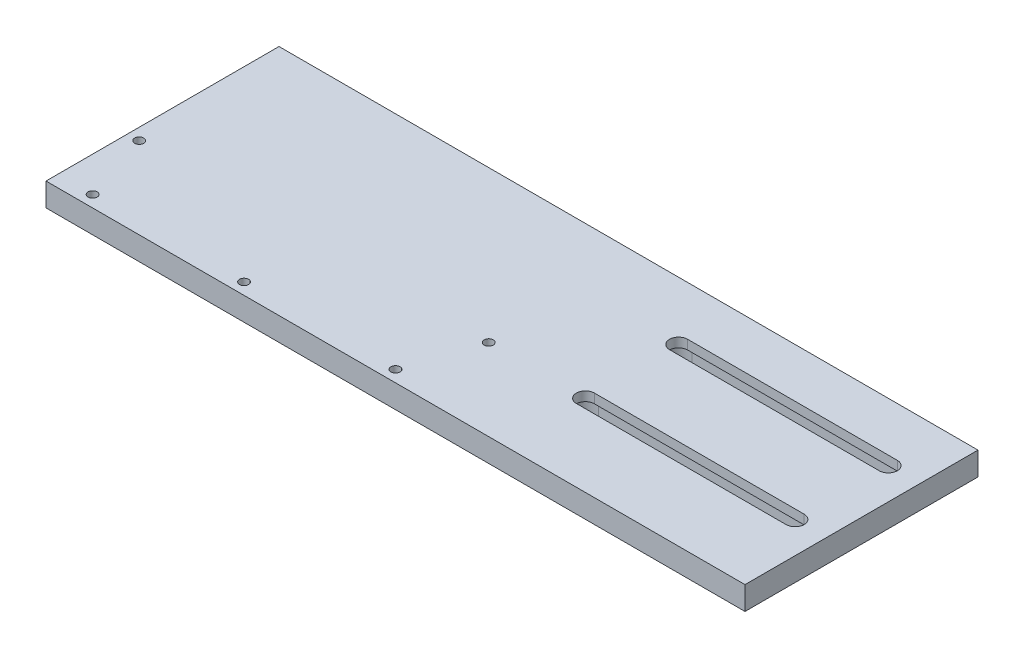
ISO-10303-21;
HEADER;
FILE_DESCRIPTION(('STEP AP214'),'2;1');
FILE_NAME('part.step','',(''),(''),'','','');
FILE_SCHEMA(('AUTOMOTIVE_DESIGN { 1 0 10303 214 1 1 1 1 }'));
ENDSEC;
DATA;
#1=APPLICATION_CONTEXT('core data for automotive mechanical design processes');
#2=APPLICATION_PROTOCOL_DEFINITION('international standard','automotive_design',2000,#1);
#3=PRODUCT_CONTEXT('',#1,'mechanical');
#4=PRODUCT('Part','Part','',(#3));
#5=PRODUCT_RELATED_PRODUCT_CATEGORY('part','',(#4));
#6=PRODUCT_DEFINITION_FORMATION('','',#4);
#7=PRODUCT_DEFINITION_CONTEXT('part definition',#1,'design');
#8=PRODUCT_DEFINITION('design','',#6,#7);
#9=PRODUCT_DEFINITION_SHAPE('','',#8);
#10=(LENGTH_UNIT() NAMED_UNIT(*) SI_UNIT(.MILLI.,.METRE.));
#11=(NAMED_UNIT(*) PLANE_ANGLE_UNIT() SI_UNIT($,.RADIAN.));
#12=(NAMED_UNIT(*) SI_UNIT($,.STERADIAN.) SOLID_ANGLE_UNIT());
#13=UNCERTAINTY_MEASURE_WITH_UNIT(LENGTH_MEASURE(1.E-05),#10,'distance_accuracy_value','');
#14=(GEOMETRIC_REPRESENTATION_CONTEXT(3) GLOBAL_UNCERTAINTY_ASSIGNED_CONTEXT((#13)) GLOBAL_UNIT_ASSIGNED_CONTEXT((#10,
#11,#12)) REPRESENTATION_CONTEXT('',''));
#15=CARTESIAN_POINT('',(0.,0.,0.));
#16=DIRECTION('',(0.,0.,1.));
#17=DIRECTION('',(1.,0.,0.));
#18=AXIS2_PLACEMENT_3D('',#15,#16,#17);
#19=CARTESIAN_POINT('',(59.055,12.7,-31.75));
#20=DIRECTION('',(0.,-1.,0.));
#21=DIRECTION('',(0.,0.,-1.));
#22=AXIS2_PLACEMENT_3D('',#19,#20,#21);
#23=CYLINDRICAL_SURFACE('',#22,4.9276);
#24=CARTESIAN_POINT('',(59.055,7.62,-31.75));
#25=DIRECTION('',(0.,-1.,0.));
#26=DIRECTION('',(0.,0.,-1.));
#27=AXIS2_PLACEMENT_3D('',#24,#25,#26);
#28=CIRCLE('',#27,4.9276);
#29=CARTESIAN_POINT('',(59.055,7.62,-36.6776));
#30=VERTEX_POINT('',#29);
#31=CARTESIAN_POINT('',(59.055,7.62,-26.8224));
#32=VERTEX_POINT('',#31);
#33=EDGE_CURVE('E210',#30,#32,#28,.F.);
#34=ORIENTED_EDGE('',*,*,#33,.F.);
#35=DIRECTION('',(0.,-1.,0.));
#36=VECTOR('',#35,1.);
#37=CARTESIAN_POINT('',(59.055,12.7,-36.6776));
#38=LINE('',#37,#36);
#39=CARTESIAN_POINT('',(59.055,12.7,-36.6776));
#40=VERTEX_POINT('',#39);
#41=EDGE_CURVE('E307',#40,#30,#38,.T.);
#42=ORIENTED_EDGE('',*,*,#41,.F.);
#43=CARTESIAN_POINT('',(59.055,12.7,-31.75));
#44=DIRECTION('',(0.,-1.,0.));
#45=DIRECTION('',(0.,0.,-1.));
#46=AXIS2_PLACEMENT_3D('',#43,#44,#45);
#47=CIRCLE('',#46,4.9276);
#48=CARTESIAN_POINT('',(59.055,12.7,-26.8224));
#49=VERTEX_POINT('',#48);
#50=EDGE_CURVE('E295',#49,#40,#47,.T.);
#51=ORIENTED_EDGE('',*,*,#50,.F.);
#52=DIRECTION('',(0.,-1.,0.));
#53=VECTOR('',#52,1.);
#54=CARTESIAN_POINT('',(59.055,12.7,-26.8224));
#55=LINE('',#54,#53);
#56=EDGE_CURVE('E308',#49,#32,#55,.T.);
#57=ORIENTED_EDGE('',*,*,#56,.T.);
#58=EDGE_LOOP('',(#34,#42,#51,#57));
#59=FACE_BOUND('',#58,.T.);
#60=ADVANCED_FACE('F33',(#59),#23,.F.);
#61=CARTESIAN_POINT('',(59.055,12.7,-26.8224));
#62=DIRECTION('',(0.,0.,1.));
#63=DIRECTION('',(1.,0.,0.));
#64=AXIS2_PLACEMENT_3D('',#61,#62,#63);
#65=PLANE('',#64);
#66=DIRECTION('',(1.,0.,0.));
#67=VECTOR('',#66,1.);
#68=CARTESIAN_POINT('',(59.055,7.62,-26.8224));
#69=LINE('',#68,#67);
#70=CARTESIAN_POINT('',(173.355,7.62,-26.8224));
#71=VERTEX_POINT('',#70);
#72=EDGE_CURVE('E208',#32,#71,#69,.T.);
#73=ORIENTED_EDGE('',*,*,#72,.F.);
#74=ORIENTED_EDGE('',*,*,#56,.F.);
#75=DIRECTION('',(-1.,0.,0.));
#76=VECTOR('',#75,1.);
#77=CARTESIAN_POINT('',(59.055,12.7,-26.8224));
#78=LINE('',#77,#76);
#79=CARTESIAN_POINT('',(173.355,12.7,-26.8224));
#80=VERTEX_POINT('',#79);
#81=EDGE_CURVE('E304',#80,#49,#78,.T.);
#82=ORIENTED_EDGE('',*,*,#81,.F.);
#83=DIRECTION('',(0.,-1.,0.));
#84=VECTOR('',#83,1.);
#85=CARTESIAN_POINT('',(173.355,12.7,-26.8224));
#86=LINE('',#85,#84);
#87=EDGE_CURVE('E312',#80,#71,#86,.T.);
#88=ORIENTED_EDGE('',*,*,#87,.T.);
#89=EDGE_LOOP('',(#73,#74,#82,#88));
#90=FACE_BOUND('',#89,.T.);
#91=ADVANCED_FACE('F402',(#90),#65,.F.);
#92=CARTESIAN_POINT('',(173.355,12.7,-31.75));
#93=DIRECTION('',(0.,-1.,0.));
#94=DIRECTION('',(0.,0.,-1.));
#95=AXIS2_PLACEMENT_3D('',#92,#93,#94);
#96=CYLINDRICAL_SURFACE('',#95,4.92759999999999);
#97=CARTESIAN_POINT('',(173.355,7.62,-31.75));
#98=DIRECTION('',(0.,-1.,0.));
#99=DIRECTION('',(0.,0.,-1.));
#100=AXIS2_PLACEMENT_3D('',#97,#98,#99);
#101=CIRCLE('',#100,4.92759999999999);
#102=CARTESIAN_POINT('',(173.355,7.62,-36.6776));
#103=VERTEX_POINT('',#102);
#104=EDGE_CURVE('E55',#71,#103,#101,.F.);
#105=ORIENTED_EDGE('',*,*,#104,.F.);
#106=ORIENTED_EDGE('',*,*,#87,.F.);
#107=CARTESIAN_POINT('',(173.355,12.7,-31.75));
#108=DIRECTION('',(0.,-1.,0.));
#109=DIRECTION('',(0.,0.,-1.));
#110=AXIS2_PLACEMENT_3D('',#107,#108,#109);
#111=CIRCLE('',#110,4.92759999999999);
#112=CARTESIAN_POINT('',(173.355,12.7,-36.6776));
#113=VERTEX_POINT('',#112);
#114=EDGE_CURVE('E301',#113,#80,#111,.T.);
#115=ORIENTED_EDGE('',*,*,#114,.F.);
#116=DIRECTION('',(0.,-1.,0.));
#117=VECTOR('',#116,1.);
#118=CARTESIAN_POINT('',(173.355,12.7,-36.6776));
#119=LINE('',#118,#117);
#120=EDGE_CURVE('E315',#113,#103,#119,.T.);
#121=ORIENTED_EDGE('',*,*,#120,.T.);
#122=EDGE_LOOP('',(#105,#106,#115,#121));
#123=FACE_BOUND('',#122,.T.);
#124=ADVANCED_FACE('F408',(#123),#96,.F.);
#125=CARTESIAN_POINT('',(173.355,12.7,-36.6776));
#126=DIRECTION('',(0.,0.,-1.));
#127=DIRECTION('',(-1.,0.,0.));
#128=AXIS2_PLACEMENT_3D('',#125,#126,#127);
#129=PLANE('',#128);
#130=DIRECTION('',(-1.,0.,0.));
#131=VECTOR('',#130,1.);
#132=CARTESIAN_POINT('',(173.355,7.62,-36.6776));
#133=LINE('',#132,#131);
#134=EDGE_CURVE('E11',#103,#30,#133,.T.);
#135=ORIENTED_EDGE('',*,*,#134,.F.);
#136=ORIENTED_EDGE('',*,*,#120,.F.);
#137=DIRECTION('',(1.,0.,0.));
#138=VECTOR('',#137,1.);
#139=CARTESIAN_POINT('',(173.355,12.7,-36.6776));
#140=LINE('',#139,#138);
#141=EDGE_CURVE('E298',#40,#113,#140,.T.);
#142=ORIENTED_EDGE('',*,*,#141,.F.);
#143=ORIENTED_EDGE('',*,*,#41,.T.);
#144=EDGE_LOOP('',(#135,#136,#142,#143));
#145=FACE_BOUND('',#144,.T.);
#146=ADVANCED_FACE('F413',(#145),#129,.F.);
#147=CARTESIAN_POINT('',(59.055,12.7,19.05));
#148=DIRECTION('',(0.,-1.,0.));
#149=DIRECTION('',(0.,0.,-1.));
#150=AXIS2_PLACEMENT_3D('',#147,#148,#149);
#151=CYLINDRICAL_SURFACE('',#150,4.9276);
#152=CARTESIAN_POINT('',(59.055,7.62,19.05));
#153=DIRECTION('',(0.,-1.,0.));
#154=DIRECTION('',(0.,0.,-1.));
#155=AXIS2_PLACEMENT_3D('',#152,#153,#154);
#156=CIRCLE('',#155,4.9276);
#157=CARTESIAN_POINT('',(59.055,7.62,14.1224));
#158=VERTEX_POINT('',#157);
#159=CARTESIAN_POINT('',(59.055,7.62,23.9776));
#160=VERTEX_POINT('',#159);
#161=EDGE_CURVE('E248',#158,#160,#156,.F.);
#162=ORIENTED_EDGE('',*,*,#161,.F.);
#163=DIRECTION('',(0.,-1.,0.));
#164=VECTOR('',#163,1.);
#165=CARTESIAN_POINT('',(59.055,12.7,14.1224));
#166=LINE('',#165,#164);
#167=CARTESIAN_POINT('',(59.055,12.7,14.1224));
#168=VERTEX_POINT('',#167);
#169=EDGE_CURVE('E331',#168,#158,#166,.T.);
#170=ORIENTED_EDGE('',*,*,#169,.F.);
#171=CARTESIAN_POINT('',(59.055,12.7,19.05));
#172=DIRECTION('',(0.,-1.,0.));
#173=DIRECTION('',(0.,0.,-1.));
#174=AXIS2_PLACEMENT_3D('',#171,#172,#173);
#175=CIRCLE('',#174,4.9276);
#176=CARTESIAN_POINT('',(59.055,12.7,23.9776));
#177=VERTEX_POINT('',#176);
#178=EDGE_CURVE('E311',#177,#168,#175,.T.);
#179=ORIENTED_EDGE('',*,*,#178,.F.);
#180=DIRECTION('',(0.,-1.,0.));
#181=VECTOR('',#180,1.);
#182=CARTESIAN_POINT('',(59.055,12.7,23.9776));
#183=LINE('',#182,#181);
#184=EDGE_CURVE('E332',#177,#160,#183,.T.);
#185=ORIENTED_EDGE('',*,*,#184,.T.);
#186=EDGE_LOOP('',(#162,#170,#179,#185));
#187=FACE_BOUND('',#186,.T.);
#188=ADVANCED_FACE('F381',(#187),#151,.F.);
#189=CARTESIAN_POINT('',(59.055,12.7,23.9776));
#190=DIRECTION('',(0.,0.,1.));
#191=DIRECTION('',(1.,0.,0.));
#192=AXIS2_PLACEMENT_3D('',#189,#190,#191);
#193=PLANE('',#192);
#194=DIRECTION('',(1.,0.,0.));
#195=VECTOR('',#194,1.);
#196=CARTESIAN_POINT('',(59.055,7.62,23.9776));
#197=LINE('',#196,#195);
#198=CARTESIAN_POINT('',(173.355,7.62,23.9776));
#199=VERTEX_POINT('',#198);
#200=EDGE_CURVE('E246',#160,#199,#197,.T.);
#201=ORIENTED_EDGE('',*,*,#200,.F.);
#202=ORIENTED_EDGE('',*,*,#184,.F.);
#203=DIRECTION('',(-1.,0.,0.));
#204=VECTOR('',#203,1.);
#205=CARTESIAN_POINT('',(59.055,12.7,23.9776));
#206=LINE('',#205,#204);
#207=CARTESIAN_POINT('',(173.355,12.7,23.9776));
#208=VERTEX_POINT('',#207);
#209=EDGE_CURVE('E328',#208,#177,#206,.T.);
#210=ORIENTED_EDGE('',*,*,#209,.F.);
#211=DIRECTION('',(0.,-1.,0.));
#212=VECTOR('',#211,1.);
#213=CARTESIAN_POINT('',(173.355,12.7,23.9776));
#214=LINE('',#213,#212);
#215=EDGE_CURVE('E336',#208,#199,#214,.T.);
#216=ORIENTED_EDGE('',*,*,#215,.T.);
#217=EDGE_LOOP('',(#201,#202,#210,#216));
#218=FACE_BOUND('',#217,.T.);
#219=ADVANCED_FACE('F390',(#218),#193,.F.);
#220=CARTESIAN_POINT('',(173.355,12.7,19.05));
#221=DIRECTION('',(0.,-1.,0.));
#222=DIRECTION('',(0.,0.,-1.));
#223=AXIS2_PLACEMENT_3D('',#220,#221,#222);
#224=CYLINDRICAL_SURFACE('',#223,4.9276);
#225=CARTESIAN_POINT('',(173.355,7.62,19.05));
#226=DIRECTION('',(0.,-1.,0.));
#227=DIRECTION('',(0.,0.,-1.));
#228=AXIS2_PLACEMENT_3D('',#225,#226,#227);
#229=CIRCLE('',#228,4.9276);
#230=CARTESIAN_POINT('',(173.355,7.62,14.1224));
#231=VERTEX_POINT('',#230);
#232=EDGE_CURVE('E238',#199,#231,#229,.F.);
#233=ORIENTED_EDGE('',*,*,#232,.F.);
#234=ORIENTED_EDGE('',*,*,#215,.F.);
#235=CARTESIAN_POINT('',(173.355,12.7,19.05));
#236=DIRECTION('',(0.,-1.,0.));
#237=DIRECTION('',(0.,0.,-1.));
#238=AXIS2_PLACEMENT_3D('',#235,#236,#237);
#239=CIRCLE('',#238,4.9276);
#240=CARTESIAN_POINT('',(173.355,12.7,14.1224));
#241=VERTEX_POINT('',#240);
#242=EDGE_CURVE('E325',#241,#208,#239,.T.);
#243=ORIENTED_EDGE('',*,*,#242,.F.);
#244=DIRECTION('',(0.,-1.,0.));
#245=VECTOR('',#244,1.);
#246=CARTESIAN_POINT('',(173.355,12.7,14.1224));
#247=LINE('',#246,#245);
#248=EDGE_CURVE('E339',#241,#231,#247,.T.);
#249=ORIENTED_EDGE('',*,*,#248,.T.);
#250=EDGE_LOOP('',(#233,#234,#243,#249));
#251=FACE_BOUND('',#250,.T.);
#252=ADVANCED_FACE('F392',(#251),#224,.F.);
#253=CARTESIAN_POINT('',(59.055,12.7,14.1224));
#254=DIRECTION('',(0.,0.,-1.));
#255=DIRECTION('',(-1.,0.,0.));
#256=AXIS2_PLACEMENT_3D('',#253,#254,#255);
#257=PLANE('',#256);
#258=DIRECTION('',(-1.,0.,0.));
#259=VECTOR('',#258,1.);
#260=CARTESIAN_POINT('',(59.055,7.62,14.1224));
#261=LINE('',#260,#259);
#262=EDGE_CURVE('E41',#231,#158,#261,.T.);
#263=ORIENTED_EDGE('',*,*,#262,.F.);
#264=ORIENTED_EDGE('',*,*,#248,.F.);
#265=DIRECTION('',(1.,0.,0.));
#266=VECTOR('',#265,1.);
#267=CARTESIAN_POINT('',(59.055,12.7,14.1224));
#268=LINE('',#267,#266);
#269=EDGE_CURVE('E322',#168,#241,#268,.T.);
#270=ORIENTED_EDGE('',*,*,#269,.F.);
#271=ORIENTED_EDGE('',*,*,#169,.T.);
#272=EDGE_LOOP('',(#263,#264,#270,#271));
#273=FACE_BOUND('',#272,.T.);
#274=ADVANCED_FACE('F384',(#273),#257,.F.);
#275=CARTESIAN_POINT('',(190.5,12.7,63.5));
#276=DIRECTION('',(-1.,0.,0.));
#277=DIRECTION('',(0.,0.,1.));
#278=AXIS2_PLACEMENT_3D('',#275,#276,#277);
#279=PLANE('',#278);
#280=DIRECTION('',(0.,0.,-1.));
#281=VECTOR('',#280,1.);
#282=CARTESIAN_POINT('',(190.5,0.,63.5));
#283=LINE('',#282,#281);
#284=CARTESIAN_POINT('',(190.5,0.,63.5));
#285=VERTEX_POINT('',#284);
#286=CARTESIAN_POINT('',(190.5,0.,-63.5));
#287=VERTEX_POINT('',#286);
#288=EDGE_CURVE('E335',#285,#287,#283,.T.);
#289=ORIENTED_EDGE('',*,*,#288,.T.);
#290=DIRECTION('',(0.,-1.,0.));
#291=VECTOR('',#290,1.);
#292=CARTESIAN_POINT('',(190.5,12.7,-63.5));
#293=LINE('',#292,#291);
#294=CARTESIAN_POINT('',(190.5,12.7,-63.5));
#295=VERTEX_POINT('',#294);
#296=EDGE_CURVE('E370',#295,#287,#293,.T.);
#297=ORIENTED_EDGE('',*,*,#296,.F.);
#298=DIRECTION('',(0.,0.,-1.));
#299=VECTOR('',#298,1.);
#300=CARTESIAN_POINT('',(190.5,12.7,63.5));
#301=LINE('',#300,#299);
#302=CARTESIAN_POINT('',(190.5,12.7,63.5));
#303=VERTEX_POINT('',#302);
#304=EDGE_CURVE('E344',#303,#295,#301,.T.);
#305=ORIENTED_EDGE('',*,*,#304,.F.);
#306=DIRECTION('',(0.,-1.,0.));
#307=VECTOR('',#306,1.);
#308=CARTESIAN_POINT('',(190.5,12.7,63.5));
#309=LINE('',#308,#307);
#310=EDGE_CURVE('E354',#303,#285,#309,.T.);
#311=ORIENTED_EDGE('',*,*,#310,.T.);
#312=EDGE_LOOP('',(#289,#297,#305,#311));
#313=FACE_BOUND('',#312,.T.);
#314=ADVANCED_FACE('F35',(#313),#279,.F.);
#315=CARTESIAN_POINT('',(-190.5,12.7,-63.5));
#316=DIRECTION('',(0.,0.,1.));
#317=DIRECTION('',(1.,0.,0.));
#318=AXIS2_PLACEMENT_3D('',#315,#316,#317);
#319=PLANE('',#318);
#320=DIRECTION('',(-1.,0.,0.));
#321=VECTOR('',#320,1.);
#322=CARTESIAN_POINT('',(-190.5,0.,-63.5));
#323=LINE('',#322,#321);
#324=CARTESIAN_POINT('',(-190.5,0.,-63.5));
#325=VERTEX_POINT('',#324);
#326=EDGE_CURVE('E357',#287,#325,#323,.T.);
#327=ORIENTED_EDGE('',*,*,#326,.T.);
#328=DIRECTION('',(0.,-1.,0.));
#329=VECTOR('',#328,1.);
#330=CARTESIAN_POINT('',(-190.5,12.7,-63.5));
#331=LINE('',#330,#329);
#332=CARTESIAN_POINT('',(-190.5,12.7,-63.5));
#333=VERTEX_POINT('',#332);
#334=EDGE_CURVE('E367',#333,#325,#331,.T.);
#335=ORIENTED_EDGE('',*,*,#334,.F.);
#336=DIRECTION('',(-1.,0.,0.));
#337=VECTOR('',#336,1.);
#338=CARTESIAN_POINT('',(-190.5,12.7,-63.5));
#339=LINE('',#338,#337);
#340=EDGE_CURVE('E347',#295,#333,#339,.T.);
#341=ORIENTED_EDGE('',*,*,#340,.F.);
#342=ORIENTED_EDGE('',*,*,#296,.T.);
#343=EDGE_LOOP('',(#327,#335,#341,#342));
#344=FACE_BOUND('',#343,.T.);
#345=ADVANCED_FACE('F671',(#344),#319,.F.);
#346=CARTESIAN_POINT('',(-190.5,12.7,63.5));
#347=DIRECTION('',(1.,0.,0.));
#348=DIRECTION('',(0.,0.,-1.));
#349=AXIS2_PLACEMENT_3D('',#346,#347,#348);
#350=PLANE('',#349);
#351=DIRECTION('',(0.,0.,1.));
#352=VECTOR('',#351,1.);
#353=CARTESIAN_POINT('',(-190.5,0.,63.5));
#354=LINE('',#353,#352);
#355=CARTESIAN_POINT('',(-190.5,0.,63.5));
#356=VERTEX_POINT('',#355);
#357=EDGE_CURVE('E359',#325,#356,#354,.T.);
#358=ORIENTED_EDGE('',*,*,#357,.T.);
#359=DIRECTION('',(0.,-1.,0.));
#360=VECTOR('',#359,1.);
#361=CARTESIAN_POINT('',(-190.5,12.7,63.5));
#362=LINE('',#361,#360);
#363=CARTESIAN_POINT('',(-190.5,12.7,63.5));
#364=VERTEX_POINT('',#363);
#365=EDGE_CURVE('E364',#364,#356,#362,.T.);
#366=ORIENTED_EDGE('',*,*,#365,.F.);
#367=DIRECTION('',(0.,0.,1.));
#368=VECTOR('',#367,1.);
#369=CARTESIAN_POINT('',(-190.5,12.7,63.5));
#370=LINE('',#369,#368);
#371=EDGE_CURVE('E350',#333,#364,#370,.T.);
#372=ORIENTED_EDGE('',*,*,#371,.F.);
#373=ORIENTED_EDGE('',*,*,#334,.T.);
#374=EDGE_LOOP('',(#358,#366,#372,#373));
#375=FACE_BOUND('',#374,.T.);
#376=ADVANCED_FACE('F662',(#375),#350,.F.);
#377=CARTESIAN_POINT('',(-190.5,12.7,63.5));
#378=DIRECTION('',(0.,0.,-1.));
#379=DIRECTION('',(-1.,0.,0.));
#380=AXIS2_PLACEMENT_3D('',#377,#378,#379);
#381=PLANE('',#380);
#382=DIRECTION('',(1.,0.,0.));
#383=VECTOR('',#382,1.);
#384=CARTESIAN_POINT('',(-190.5,0.,63.5));
#385=LINE('',#384,#383);
#386=EDGE_CURVE('E348',#356,#285,#385,.T.);
#387=ORIENTED_EDGE('',*,*,#386,.T.);
#388=ORIENTED_EDGE('',*,*,#310,.F.);
#389=DIRECTION('',(1.,0.,0.));
#390=VECTOR('',#389,1.);
#391=CARTESIAN_POINT('',(-190.5,12.7,63.5));
#392=LINE('',#391,#390);
#393=EDGE_CURVE('E352',#364,#303,#392,.T.);
#394=ORIENTED_EDGE('',*,*,#393,.F.);
#395=ORIENTED_EDGE('',*,*,#365,.T.);
#396=EDGE_LOOP('',(#387,#388,#394,#395));
#397=FACE_BOUND('',#396,.T.);
#398=ADVANCED_FACE('F654',(#397),#381,.F.);
#399=CARTESIAN_POINT('',(0.,12.7,0.));
#400=DIRECTION('',(0.,-1.,0.));
#401=DIRECTION('',(0.,0.,-1.));
#402=AXIS2_PLACEMENT_3D('',#399,#400,#401);
#403=PLANE('',#402);
#404=CARTESIAN_POINT('',(-184.15,12.7,19.05));
#405=DIRECTION('',(0.,-1.,0.));
#406=DIRECTION('',(0.,0.,-1.));
#407=AXIS2_PLACEMENT_3D('',#404,#405,#406);
#408=CIRCLE('',#407,2.4892);
#409=CARTESIAN_POINT('',(-184.15,12.7,16.5608));
#410=VERTEX_POINT('',#409);
#411=EDGE_CURVE('E256',#410,#410,#408,.T.);
#412=ORIENTED_EDGE('',*,*,#411,.T.);
#413=EDGE_LOOP('',(#412));
#414=FACE_BOUND('',#413,.T.);
#415=CARTESIAN_POINT('',(6.35000000000005,12.7,19.05));
#416=DIRECTION('',(0.,-1.,0.));
#417=DIRECTION('',(0.,0.,-1.));
#418=AXIS2_PLACEMENT_3D('',#415,#416,#417);
#419=CIRCLE('',#418,2.4892);
#420=CARTESIAN_POINT('',(6.35000000000005,12.7,16.5608));
#421=VERTEX_POINT('',#420);
#422=EDGE_CURVE('E265',#421,#421,#419,.T.);
#423=ORIENTED_EDGE('',*,*,#422,.T.);
#424=EDGE_LOOP('',(#423));
#425=FACE_BOUND('',#424,.T.);
#426=CARTESIAN_POINT('',(-171.45,12.7,57.15));
#427=DIRECTION('',(0.,-1.,0.));
#428=DIRECTION('',(0.,0.,-1.));
#429=AXIS2_PLACEMENT_3D('',#426,#427,#428);
#430=CIRCLE('',#429,2.4892);
#431=CARTESIAN_POINT('',(-171.45,12.7,54.6608));
#432=VERTEX_POINT('',#431);
#433=EDGE_CURVE('E274',#432,#432,#430,.T.);
#434=ORIENTED_EDGE('',*,*,#433,.T.);
#435=EDGE_LOOP('',(#434));
#436=FACE_BOUND('',#435,.T.);
#437=CARTESIAN_POINT('',(-88.8999999999999,12.7,57.15));
#438=DIRECTION('',(0.,-1.,0.));
#439=DIRECTION('',(0.,0.,-1.));
#440=AXIS2_PLACEMENT_3D('',#437,#438,#439);
#441=CIRCLE('',#440,2.4892);
#442=CARTESIAN_POINT('',(-88.8999999999999,12.7,54.6608));
#443=VERTEX_POINT('',#442);
#444=EDGE_CURVE('E283',#443,#443,#441,.T.);
#445=ORIENTED_EDGE('',*,*,#444,.T.);
#446=EDGE_LOOP('',(#445));
#447=FACE_BOUND('',#446,.T.);
#448=CARTESIAN_POINT('',(-6.34999999999994,12.7,57.15));
#449=DIRECTION('',(0.,-1.,0.));
#450=DIRECTION('',(0.,0.,-1.));
#451=AXIS2_PLACEMENT_3D('',#448,#449,#450);
#452=CIRCLE('',#451,2.4892);
#453=CARTESIAN_POINT('',(-6.34999999999994,12.7,54.6608));
#454=VERTEX_POINT('',#453);
#455=EDGE_CURVE('E292',#454,#454,#452,.T.);
#456=ORIENTED_EDGE('',*,*,#455,.T.);
#457=EDGE_LOOP('',(#456));
#458=FACE_BOUND('',#457,.T.);
#459=ORIENTED_EDGE('',*,*,#81,.T.);
#460=ORIENTED_EDGE('',*,*,#50,.T.);
#461=ORIENTED_EDGE('',*,*,#141,.T.);
#462=ORIENTED_EDGE('',*,*,#114,.T.);
#463=EDGE_LOOP('',(#459,#460,#461,#462));
#464=FACE_BOUND('',#463,.T.);
#465=ORIENTED_EDGE('',*,*,#209,.T.);
#466=ORIENTED_EDGE('',*,*,#178,.T.);
#467=ORIENTED_EDGE('',*,*,#269,.T.);
#468=ORIENTED_EDGE('',*,*,#242,.T.);
#469=EDGE_LOOP('',(#465,#466,#467,#468));
#470=FACE_BOUND('',#469,.T.);
#471=ORIENTED_EDGE('',*,*,#304,.T.);
#472=ORIENTED_EDGE('',*,*,#340,.T.);
#473=ORIENTED_EDGE('',*,*,#371,.T.);
#474=ORIENTED_EDGE('',*,*,#393,.T.);
#475=EDGE_LOOP('',(#471,#472,#473,#474));
#476=FACE_BOUND('',#475,.T.);
#477=ADVANCED_FACE('F386',(#414,#425,#436,#447,#458,#464,#470,#476),#403,.F.);
#478=CARTESIAN_POINT('',(0.,0.,0.));
#479=DIRECTION('',(0.,-1.,0.));
#480=DIRECTION('',(0.,0.,-1.));
#481=AXIS2_PLACEMENT_3D('',#478,#479,#480);
#482=PLANE('',#481);
#483=CARTESIAN_POINT('',(59.055,0.,-31.75));
#484=DIRECTION('',(0.,-1.,0.));
#485=DIRECTION('',(0.,0.,-1.));
#486=AXIS2_PLACEMENT_3D('',#483,#484,#485);
#487=CIRCLE('',#486,7.239);
#488=CARTESIAN_POINT('',(59.055,0.,-24.511));
#489=VERTEX_POINT('',#488);
#490=CARTESIAN_POINT('',(59.055,0.,-38.989));
#491=VERTEX_POINT('',#490);
#492=EDGE_CURVE('E48',#489,#491,#487,.T.);
#493=ORIENTED_EDGE('',*,*,#492,.F.);
#494=DIRECTION('',(-1.,0.,0.));
#495=VECTOR('',#494,1.);
#496=CARTESIAN_POINT('',(59.055,0.,-24.511));
#497=LINE('',#496,#495);
#498=CARTESIAN_POINT('',(173.355,0.,-24.511));
#499=VERTEX_POINT('',#498);
#500=EDGE_CURVE('E189',#499,#489,#497,.T.);
#501=ORIENTED_EDGE('',*,*,#500,.F.);
#502=CARTESIAN_POINT('',(173.355,0.,-31.75));
#503=DIRECTION('',(0.,-1.,0.));
#504=DIRECTION('',(0.,0.,-1.));
#505=AXIS2_PLACEMENT_3D('',#502,#503,#504);
#506=CIRCLE('',#505,7.23899999999998);
#507=CARTESIAN_POINT('',(173.355,0.,-38.989));
#508=VERTEX_POINT('',#507);
#509=EDGE_CURVE('E192',#508,#499,#506,.T.);
#510=ORIENTED_EDGE('',*,*,#509,.F.);
#511=DIRECTION('',(1.,0.,0.));
#512=VECTOR('',#511,1.);
#513=CARTESIAN_POINT('',(173.355,0.,-38.989));
#514=LINE('',#513,#512);
#515=EDGE_CURVE('E198',#491,#508,#514,.T.);
#516=ORIENTED_EDGE('',*,*,#515,.F.);
#517=EDGE_LOOP('',(#493,#501,#510,#516));
#518=FACE_BOUND('',#517,.T.);
#519=CARTESIAN_POINT('',(59.055,0.,19.05));
#520=DIRECTION('',(0.,-1.,0.));
#521=DIRECTION('',(0.,0.,-1.));
#522=AXIS2_PLACEMENT_3D('',#519,#520,#521);
#523=CIRCLE('',#522,7.239);
#524=CARTESIAN_POINT('',(59.055,0.,26.289));
#525=VERTEX_POINT('',#524);
#526=CARTESIAN_POINT('',(59.055,0.,11.811));
#527=VERTEX_POINT('',#526);
#528=EDGE_CURVE('E212',#525,#527,#523,.T.);
#529=ORIENTED_EDGE('',*,*,#528,.F.);
#530=DIRECTION('',(-1.,0.,0.));
#531=VECTOR('',#530,1.);
#532=CARTESIAN_POINT('',(59.055,0.,26.289));
#533=LINE('',#532,#531);
#534=CARTESIAN_POINT('',(173.355,0.,26.289));
#535=VERTEX_POINT('',#534);
#536=EDGE_CURVE('E217',#535,#525,#533,.T.);
#537=ORIENTED_EDGE('',*,*,#536,.F.);
#538=CARTESIAN_POINT('',(173.355,0.,19.05));
#539=DIRECTION('',(0.,-1.,0.));
#540=DIRECTION('',(0.,0.,-1.));
#541=AXIS2_PLACEMENT_3D('',#538,#539,#540);
#542=CIRCLE('',#541,7.23899999999998);
#543=CARTESIAN_POINT('',(173.355,0.,11.811));
#544=VERTEX_POINT('',#543);
#545=EDGE_CURVE('E231',#544,#535,#542,.T.);
#546=ORIENTED_EDGE('',*,*,#545,.F.);
#547=DIRECTION('',(1.,0.,0.));
#548=VECTOR('',#547,1.);
#549=CARTESIAN_POINT('',(173.355,0.,11.811));
#550=LINE('',#549,#548);
#551=EDGE_CURVE('E228',#527,#544,#550,.T.);
#552=ORIENTED_EDGE('',*,*,#551,.F.);
#553=EDGE_LOOP('',(#529,#537,#546,#552));
#554=FACE_BOUND('',#553,.T.);
#555=CARTESIAN_POINT('',(-184.15,0.,19.05));
#556=DIRECTION('',(0.,-1.,0.));
#557=DIRECTION('',(0.,0.,-1.));
#558=AXIS2_PLACEMENT_3D('',#555,#556,#557);
#559=CIRCLE('',#558,4.88949999999999);
#560=CARTESIAN_POINT('',(-184.15,0.,14.1605));
#561=VERTEX_POINT('',#560);
#562=EDGE_CURVE('E250',#561,#561,#559,.T.);
#563=ORIENTED_EDGE('',*,*,#562,.F.);
#564=EDGE_LOOP('',(#563));
#565=FACE_BOUND('',#564,.T.);
#566=CARTESIAN_POINT('',(6.35000000000005,0.,19.05));
#567=DIRECTION('',(0.,-1.,0.));
#568=DIRECTION('',(0.,0.,-1.));
#569=AXIS2_PLACEMENT_3D('',#566,#567,#568);
#570=CIRCLE('',#569,4.8895);
#571=CARTESIAN_POINT('',(6.35000000000005,0.,14.1605));
#572=VERTEX_POINT('',#571);
#573=EDGE_CURVE('E259',#572,#572,#570,.T.);
#574=ORIENTED_EDGE('',*,*,#573,.F.);
#575=EDGE_LOOP('',(#574));
#576=FACE_BOUND('',#575,.T.);
#577=CARTESIAN_POINT('',(-171.45,0.,57.15));
#578=DIRECTION('',(0.,-1.,0.));
#579=DIRECTION('',(0.,0.,-1.));
#580=AXIS2_PLACEMENT_3D('',#577,#578,#579);
#581=CIRCLE('',#580,4.88949999999999);
#582=CARTESIAN_POINT('',(-171.45,0.,52.2605));
#583=VERTEX_POINT('',#582);
#584=EDGE_CURVE('E268',#583,#583,#581,.T.);
#585=ORIENTED_EDGE('',*,*,#584,.F.);
#586=EDGE_LOOP('',(#585));
#587=FACE_BOUND('',#586,.T.);
#588=CARTESIAN_POINT('',(-88.8999999999999,0.,57.15));
#589=DIRECTION('',(0.,-1.,0.));
#590=DIRECTION('',(0.,0.,-1.));
#591=AXIS2_PLACEMENT_3D('',#588,#589,#590);
#592=CIRCLE('',#591,4.88950000000001);
#593=CARTESIAN_POINT('',(-88.8999999999999,0.,52.2605));
#594=VERTEX_POINT('',#593);
#595=EDGE_CURVE('E277',#594,#594,#592,.T.);
#596=ORIENTED_EDGE('',*,*,#595,.F.);
#597=EDGE_LOOP('',(#596));
#598=FACE_BOUND('',#597,.T.);
#599=CARTESIAN_POINT('',(-6.34999999999994,0.,57.15));
#600=DIRECTION('',(0.,-1.,0.));
#601=DIRECTION('',(0.,0.,-1.));
#602=AXIS2_PLACEMENT_3D('',#599,#600,#601);
#603=CIRCLE('',#602,4.8895);
#604=CARTESIAN_POINT('',(-6.34999999999994,0.,52.2605));
#605=VERTEX_POINT('',#604);
#606=EDGE_CURVE('E286',#605,#605,#603,.T.);
#607=ORIENTED_EDGE('',*,*,#606,.F.);
#608=EDGE_LOOP('',(#607));
#609=FACE_BOUND('',#608,.T.);
#610=ORIENTED_EDGE('',*,*,#288,.F.);
#611=ORIENTED_EDGE('',*,*,#386,.F.);
#612=ORIENTED_EDGE('',*,*,#357,.F.);
#613=ORIENTED_EDGE('',*,*,#326,.F.);
#614=EDGE_LOOP('',(#610,#611,#612,#613));
#615=FACE_BOUND('',#614,.T.);
#616=ADVANCED_FACE('F424',(#518,#554,#565,#576,#587,#598,#609,#615),#482,.T.);
#617=CARTESIAN_POINT('',(-6.34999999999994,0.,57.15));
#618=DIRECTION('',(0.,-1.,0.));
#619=DIRECTION('',(0.,0.,-1.));
#620=AXIS2_PLACEMENT_3D('',#617,#618,#619);
#621=CYLINDRICAL_SURFACE('',#620,2.4892);
#622=ORIENTED_EDGE('',*,*,#455,.F.);
#623=EDGE_LOOP('',(#622));
#624=FACE_BOUND('',#623,.T.);
#625=CARTESIAN_POINT('',(-6.34999999999994,2.01409084471483,57.15));
#626=DIRECTION('',(0.,-1.,0.));
#627=DIRECTION('',(0.,0.,-1.));
#628=AXIS2_PLACEMENT_3D('',#625,#626,#627);
#629=CIRCLE('',#628,2.4892);
#630=CARTESIAN_POINT('',(-6.34999999999994,2.01409084471483,54.6608));
#631=VERTEX_POINT('',#630);
#632=EDGE_CURVE('E289',#631,#631,#629,.T.);
#633=ORIENTED_EDGE('',*,*,#632,.T.);
#634=EDGE_LOOP('',(#633));
#635=FACE_BOUND('',#634,.T.);
#636=ADVANCED_FACE('F420',(#624,#635),#621,.F.);
#637=CARTESIAN_POINT('',(-6.34999999999994,0.,57.15));
#638=DIRECTION('',(0.,-1.,0.));
#639=DIRECTION('',(0.,0.,-1.));
#640=AXIS2_PLACEMENT_3D('',#637,#638,#639);
#641=CONICAL_SURFACE('',#640,4.8895,0.872664625997165);
#642=ORIENTED_EDGE('',*,*,#632,.F.);
#643=EDGE_LOOP('',(#642));
#644=FACE_BOUND('',#643,.T.);
#645=ORIENTED_EDGE('',*,*,#606,.T.);
#646=EDGE_LOOP('',(#645));
#647=FACE_BOUND('',#646,.T.);
#648=ADVANCED_FACE('F423',(#644,#647),#641,.F.);
#649=CARTESIAN_POINT('',(-88.8999999999999,0.,57.15));
#650=DIRECTION('',(0.,-1.,0.));
#651=DIRECTION('',(0.,0.,-1.));
#652=AXIS2_PLACEMENT_3D('',#649,#650,#651);
#653=CYLINDRICAL_SURFACE('',#652,2.4892);
#654=ORIENTED_EDGE('',*,*,#444,.F.);
#655=EDGE_LOOP('',(#654));
#656=FACE_BOUND('',#655,.T.);
#657=CARTESIAN_POINT('',(-88.8999999999999,2.01409084471483,57.15));
#658=DIRECTION('',(0.,-1.,0.));
#659=DIRECTION('',(0.,0.,-1.));
#660=AXIS2_PLACEMENT_3D('',#657,#658,#659);
#661=CIRCLE('',#660,2.4892);
#662=CARTESIAN_POINT('',(-88.8999999999999,2.01409084471483,54.6608));
#663=VERTEX_POINT('',#662);
#664=EDGE_CURVE('E280',#663,#663,#661,.T.);
#665=ORIENTED_EDGE('',*,*,#664,.T.);
#666=EDGE_LOOP('',(#665));
#667=FACE_BOUND('',#666,.T.);
#668=ADVANCED_FACE('F428',(#656,#667),#653,.F.);
#669=CARTESIAN_POINT('',(-88.8999999999999,0.,57.15));
#670=DIRECTION('',(0.,-1.,0.));
#671=DIRECTION('',(0.,0.,-1.));
#672=AXIS2_PLACEMENT_3D('',#669,#670,#671);
#673=CONICAL_SURFACE('',#672,4.88950000000001,0.872664625997166);
#674=ORIENTED_EDGE('',*,*,#664,.F.);
#675=EDGE_LOOP('',(#674));
#676=FACE_BOUND('',#675,.T.);
#677=ORIENTED_EDGE('',*,*,#595,.T.);
#678=EDGE_LOOP('',(#677));
#679=FACE_BOUND('',#678,.T.);
#680=ADVANCED_FACE('F432',(#676,#679),#673,.F.);
#681=CARTESIAN_POINT('',(-171.45,0.,57.15));
#682=DIRECTION('',(0.,-1.,0.));
#683=DIRECTION('',(0.,0.,-1.));
#684=AXIS2_PLACEMENT_3D('',#681,#682,#683);
#685=CYLINDRICAL_SURFACE('',#684,2.4892);
#686=ORIENTED_EDGE('',*,*,#433,.F.);
#687=EDGE_LOOP('',(#686));
#688=FACE_BOUND('',#687,.T.);
#689=CARTESIAN_POINT('',(-171.45,2.01409084471483,57.15));
#690=DIRECTION('',(0.,-1.,0.));
#691=DIRECTION('',(0.,0.,-1.));
#692=AXIS2_PLACEMENT_3D('',#689,#690,#691);
#693=CIRCLE('',#692,2.4892);
#694=CARTESIAN_POINT('',(-171.45,2.01409084471483,54.6608));
#695=VERTEX_POINT('',#694);
#696=EDGE_CURVE('E271',#695,#695,#693,.T.);
#697=ORIENTED_EDGE('',*,*,#696,.T.);
#698=EDGE_LOOP('',(#697));
#699=FACE_BOUND('',#698,.T.);
#700=ADVANCED_FACE('F436',(#688,#699),#685,.F.);
#701=CARTESIAN_POINT('',(-171.45,0.,57.15));
#702=DIRECTION('',(0.,-1.,0.));
#703=DIRECTION('',(0.,0.,-1.));
#704=AXIS2_PLACEMENT_3D('',#701,#702,#703);
#705=CONICAL_SURFACE('',#704,4.88949999999999,0.872664625997164);
#706=ORIENTED_EDGE('',*,*,#696,.F.);
#707=EDGE_LOOP('',(#706));
#708=FACE_BOUND('',#707,.T.);
#709=ORIENTED_EDGE('',*,*,#584,.T.);
#710=EDGE_LOOP('',(#709));
#711=FACE_BOUND('',#710,.T.);
#712=ADVANCED_FACE('F440',(#708,#711),#705,.F.);
#713=CARTESIAN_POINT('',(6.35000000000005,0.,19.05));
#714=DIRECTION('',(0.,-1.,0.));
#715=DIRECTION('',(0.,0.,-1.));
#716=AXIS2_PLACEMENT_3D('',#713,#714,#715);
#717=CYLINDRICAL_SURFACE('',#716,2.48919999999999);
#718=ORIENTED_EDGE('',*,*,#422,.F.);
#719=EDGE_LOOP('',(#718));
#720=FACE_BOUND('',#719,.T.);
#721=CARTESIAN_POINT('',(6.35000000000005,2.01409084471482,19.05));
#722=DIRECTION('',(0.,-1.,0.));
#723=DIRECTION('',(0.,0.,-1.));
#724=AXIS2_PLACEMENT_3D('',#721,#722,#723);
#725=CIRCLE('',#724,2.48919999999999);
#726=CARTESIAN_POINT('',(6.35000000000005,2.01409084471482,16.5608));
#727=VERTEX_POINT('',#726);
#728=EDGE_CURVE('E262',#727,#727,#725,.T.);
#729=ORIENTED_EDGE('',*,*,#728,.T.);
#730=EDGE_LOOP('',(#729));
#731=FACE_BOUND('',#730,.T.);
#732=ADVANCED_FACE('F444',(#720,#731),#717,.F.);
#733=CARTESIAN_POINT('',(6.35000000000005,0.,19.05));
#734=DIRECTION('',(0.,-1.,0.));
#735=DIRECTION('',(0.,0.,-1.));
#736=AXIS2_PLACEMENT_3D('',#733,#734,#735);
#737=CONICAL_SURFACE('',#736,4.8895,0.872664625997168);
#738=ORIENTED_EDGE('',*,*,#728,.F.);
#739=EDGE_LOOP('',(#738));
#740=FACE_BOUND('',#739,.T.);
#741=ORIENTED_EDGE('',*,*,#573,.T.);
#742=EDGE_LOOP('',(#741));
#743=FACE_BOUND('',#742,.T.);
#744=ADVANCED_FACE('F448',(#740,#743),#737,.F.);
#745=CARTESIAN_POINT('',(-184.15,0.,19.05));
#746=DIRECTION('',(0.,-1.,0.));
#747=DIRECTION('',(0.,0.,-1.));
#748=AXIS2_PLACEMENT_3D('',#745,#746,#747);
#749=CYLINDRICAL_SURFACE('',#748,2.4892);
#750=ORIENTED_EDGE('',*,*,#411,.F.);
#751=EDGE_LOOP('',(#750));
#752=FACE_BOUND('',#751,.T.);
#753=CARTESIAN_POINT('',(-184.15,2.01409084471482,19.05));
#754=DIRECTION('',(0.,-1.,0.));
#755=DIRECTION('',(0.,0.,-1.));
#756=AXIS2_PLACEMENT_3D('',#753,#754,#755);
#757=CIRCLE('',#756,2.4892);
#758=CARTESIAN_POINT('',(-184.15,2.01409084471482,16.5608));
#759=VERTEX_POINT('',#758);
#760=EDGE_CURVE('E253',#759,#759,#757,.T.);
#761=ORIENTED_EDGE('',*,*,#760,.T.);
#762=EDGE_LOOP('',(#761));
#763=FACE_BOUND('',#762,.T.);
#764=ADVANCED_FACE('F452',(#752,#763),#749,.F.);
#765=CARTESIAN_POINT('',(-184.15,0.,19.05));
#766=DIRECTION('',(0.,-1.,0.));
#767=DIRECTION('',(0.,0.,-1.));
#768=AXIS2_PLACEMENT_3D('',#765,#766,#767);
#769=CONICAL_SURFACE('',#768,4.88949999999999,0.872664625997164);
#770=ORIENTED_EDGE('',*,*,#760,.F.);
#771=EDGE_LOOP('',(#770));
#772=FACE_BOUND('',#771,.T.);
#773=ORIENTED_EDGE('',*,*,#562,.T.);
#774=EDGE_LOOP('',(#773));
#775=FACE_BOUND('',#774,.T.);
#776=ADVANCED_FACE('F456',(#772,#775),#769,.F.);
#777=CARTESIAN_POINT('',(59.055,7.62,19.05));
#778=DIRECTION('',(0.,-1.,0.));
#779=DIRECTION('',(0.,0.,-1.));
#780=AXIS2_PLACEMENT_3D('',#777,#778,#779);
#781=PLANE('',#780);
#782=CARTESIAN_POINT('',(59.055,7.62,19.05));
#783=DIRECTION('',(0.,-1.,0.));
#784=DIRECTION('',(0.,0.,-1.));
#785=AXIS2_PLACEMENT_3D('',#782,#783,#784);
#786=CIRCLE('',#785,7.239);
#787=CARTESIAN_POINT('',(59.055,7.62,26.289));
#788=VERTEX_POINT('',#787);
#789=CARTESIAN_POINT('',(59.055,7.62,11.811));
#790=VERTEX_POINT('',#789);
#791=EDGE_CURVE('E213',#788,#790,#786,.T.);
#792=ORIENTED_EDGE('',*,*,#791,.T.);
#793=DIRECTION('',(1.,0.,0.));
#794=VECTOR('',#793,1.);
#795=CARTESIAN_POINT('',(173.355,7.62,11.811));
#796=LINE('',#795,#794);
#797=CARTESIAN_POINT('',(173.355,7.62,11.811));
#798=VERTEX_POINT('',#797);
#799=EDGE_CURVE('E216',#790,#798,#796,.T.);
#800=ORIENTED_EDGE('',*,*,#799,.T.);
#801=CARTESIAN_POINT('',(173.355,7.62,19.05));
#802=DIRECTION('',(0.,-1.,0.));
#803=DIRECTION('',(0.,0.,-1.));
#804=AXIS2_PLACEMENT_3D('',#801,#802,#803);
#805=CIRCLE('',#804,7.23899999999998);
#806=CARTESIAN_POINT('',(173.355,7.62,26.289));
#807=VERTEX_POINT('',#806);
#808=EDGE_CURVE('E220',#798,#807,#805,.T.);
#809=ORIENTED_EDGE('',*,*,#808,.T.);
#810=DIRECTION('',(-1.,0.,0.));
#811=VECTOR('',#810,1.);
#812=CARTESIAN_POINT('',(59.055,7.62,26.289));
#813=LINE('',#812,#811);
#814=EDGE_CURVE('E223',#807,#788,#813,.T.);
#815=ORIENTED_EDGE('',*,*,#814,.T.);
#816=EDGE_LOOP('',(#792,#800,#809,#815));
#817=FACE_BOUND('',#816,.T.);
#818=ORIENTED_EDGE('',*,*,#161,.T.);
#819=ORIENTED_EDGE('',*,*,#200,.T.);
#820=ORIENTED_EDGE('',*,*,#232,.T.);
#821=ORIENTED_EDGE('',*,*,#262,.T.);
#822=EDGE_LOOP('',(#818,#819,#820,#821));
#823=FACE_BOUND('',#822,.T.);
#824=ADVANCED_FACE('F375',(#817,#823),#781,.T.);
#825=CARTESIAN_POINT('',(59.055,7.62,19.05));
#826=DIRECTION('',(0.,-1.,0.));
#827=DIRECTION('',(0.,0.,-1.));
#828=AXIS2_PLACEMENT_3D('',#825,#826,#827);
#829=CYLINDRICAL_SURFACE('',#828,7.239);
#830=ORIENTED_EDGE('',*,*,#528,.T.);
#831=DIRECTION('',(0.,-1.,0.));
#832=VECTOR('',#831,1.);
#833=CARTESIAN_POINT('',(59.055,7.62,11.811));
#834=LINE('',#833,#832);
#835=EDGE_CURVE('E226',#790,#527,#834,.T.);
#836=ORIENTED_EDGE('',*,*,#835,.F.);
#837=ORIENTED_EDGE('',*,*,#791,.F.);
#838=DIRECTION('',(0.,-1.,0.));
#839=VECTOR('',#838,1.);
#840=CARTESIAN_POINT('',(59.055,7.62,26.289));
#841=LINE('',#840,#839);
#842=EDGE_CURVE('E236',#788,#525,#841,.T.);
#843=ORIENTED_EDGE('',*,*,#842,.T.);
#844=EDGE_LOOP('',(#830,#836,#837,#843));
#845=FACE_BOUND('',#844,.T.);
#846=ADVANCED_FACE('F461',(#845),#829,.F.);
#847=CARTESIAN_POINT('',(59.055,7.62,26.289));
#848=DIRECTION('',(0.,0.,1.));
#849=DIRECTION('',(1.,0.,0.));
#850=AXIS2_PLACEMENT_3D('',#847,#848,#849);
#851=PLANE('',#850);
#852=ORIENTED_EDGE('',*,*,#536,.T.);
#853=ORIENTED_EDGE('',*,*,#842,.F.);
#854=ORIENTED_EDGE('',*,*,#814,.F.);
#855=DIRECTION('',(0.,-1.,0.));
#856=VECTOR('',#855,1.);
#857=CARTESIAN_POINT('',(173.355,7.62,26.289));
#858=LINE('',#857,#856);
#859=EDGE_CURVE('E239',#807,#535,#858,.T.);
#860=ORIENTED_EDGE('',*,*,#859,.T.);
#861=EDGE_LOOP('',(#852,#853,#854,#860));
#862=FACE_BOUND('',#861,.T.);
#863=ADVANCED_FACE('F464',(#862),#851,.F.);
#864=CARTESIAN_POINT('',(173.355,7.62,19.05));
#865=DIRECTION('',(0.,-1.,0.));
#866=DIRECTION('',(0.,0.,-1.));
#867=AXIS2_PLACEMENT_3D('',#864,#865,#866);
#868=CYLINDRICAL_SURFACE('',#867,7.23899999999998);
#869=ORIENTED_EDGE('',*,*,#545,.T.);
#870=ORIENTED_EDGE('',*,*,#859,.F.);
#871=ORIENTED_EDGE('',*,*,#808,.F.);
#872=DIRECTION('',(0.,-1.,0.));
#873=VECTOR('',#872,1.);
#874=CARTESIAN_POINT('',(173.355,7.62,11.811));
#875=LINE('',#874,#873);
#876=EDGE_CURVE('E241',#798,#544,#875,.T.);
#877=ORIENTED_EDGE('',*,*,#876,.T.);
#878=EDGE_LOOP('',(#869,#870,#871,#877));
#879=FACE_BOUND('',#878,.T.);
#880=ADVANCED_FACE('F469',(#879),#868,.F.);
#881=CARTESIAN_POINT('',(173.355,7.62,11.811));
#882=DIRECTION('',(0.,0.,-1.));
#883=DIRECTION('',(-1.,0.,0.));
#884=AXIS2_PLACEMENT_3D('',#881,#882,#883);
#885=PLANE('',#884);
#886=ORIENTED_EDGE('',*,*,#551,.T.);
#887=ORIENTED_EDGE('',*,*,#876,.F.);
#888=ORIENTED_EDGE('',*,*,#799,.F.);
#889=ORIENTED_EDGE('',*,*,#835,.T.);
#890=EDGE_LOOP('',(#886,#887,#888,#889));
#891=FACE_BOUND('',#890,.T.);
#892=ADVANCED_FACE('F466',(#891),#885,.F.);
#893=CARTESIAN_POINT('',(59.055,7.62,-31.75));
#894=DIRECTION('',(0.,-1.,0.));
#895=DIRECTION('',(0.,0.,-1.));
#896=AXIS2_PLACEMENT_3D('',#893,#894,#895);
#897=PLANE('',#896);
#898=CARTESIAN_POINT('',(59.055,7.62,-31.75));
#899=DIRECTION('',(0.,-1.,0.));
#900=DIRECTION('',(0.,0.,-1.));
#901=AXIS2_PLACEMENT_3D('',#898,#899,#900);
#902=CIRCLE('',#901,7.239);
#903=CARTESIAN_POINT('',(59.055,7.62,-24.511));
#904=VERTEX_POINT('',#903);
#905=CARTESIAN_POINT('',(59.055,7.62,-38.989));
#906=VERTEX_POINT('',#905);
#907=EDGE_CURVE('E171',#904,#906,#902,.T.);
#908=ORIENTED_EDGE('',*,*,#907,.T.);
#909=DIRECTION('',(1.,0.,0.));
#910=VECTOR('',#909,1.);
#911=CARTESIAN_POINT('',(173.355,7.62,-38.989));
#912=LINE('',#911,#910);
#913=CARTESIAN_POINT('',(173.355,7.62,-38.989));
#914=VERTEX_POINT('',#913);
#915=EDGE_CURVE('E180',#906,#914,#912,.T.);
#916=ORIENTED_EDGE('',*,*,#915,.T.);
#917=CARTESIAN_POINT('',(173.355,7.62,-31.75));
#918=DIRECTION('',(0.,-1.,0.));
#919=DIRECTION('',(0.,0.,-1.));
#920=AXIS2_PLACEMENT_3D('',#917,#918,#919);
#921=CIRCLE('',#920,7.23899999999998);
#922=CARTESIAN_POINT('',(173.355,7.62,-24.511));
#923=VERTEX_POINT('',#922);
#924=EDGE_CURVE('E185',#914,#923,#921,.T.);
#925=ORIENTED_EDGE('',*,*,#924,.T.);
#926=DIRECTION('',(-1.,0.,0.));
#927=VECTOR('',#926,1.);
#928=CARTESIAN_POINT('',(59.055,7.62,-24.511));
#929=LINE('',#928,#927);
#930=EDGE_CURVE('E177',#923,#904,#929,.T.);
#931=ORIENTED_EDGE('',*,*,#930,.T.);
#932=EDGE_LOOP('',(#908,#916,#925,#931));
#933=FACE_BOUND('',#932,.T.);
#934=ORIENTED_EDGE('',*,*,#33,.T.);
#935=ORIENTED_EDGE('',*,*,#72,.T.);
#936=ORIENTED_EDGE('',*,*,#104,.T.);
#937=ORIENTED_EDGE('',*,*,#134,.T.);
#938=EDGE_LOOP('',(#934,#935,#936,#937));
#939=FACE_BOUND('',#938,.T.);
#940=ADVANCED_FACE('F187',(#933,#939),#897,.T.);
#941=CARTESIAN_POINT('',(59.055,7.62,-31.75));
#942=DIRECTION('',(0.,-1.,0.));
#943=DIRECTION('',(0.,0.,-1.));
#944=AXIS2_PLACEMENT_3D('',#941,#942,#943);
#945=CYLINDRICAL_SURFACE('',#944,7.239);
#946=ORIENTED_EDGE('',*,*,#492,.T.);
#947=DIRECTION('',(0.,-1.,0.));
#948=VECTOR('',#947,1.);
#949=CARTESIAN_POINT('',(59.055,7.62,-38.989));
#950=LINE('',#949,#948);
#951=EDGE_CURVE('E167',#906,#491,#950,.T.);
#952=ORIENTED_EDGE('',*,*,#951,.F.);
#953=ORIENTED_EDGE('',*,*,#907,.F.);
#954=DIRECTION('',(0.,-1.,0.));
#955=VECTOR('',#954,1.);
#956=CARTESIAN_POINT('',(59.055,7.62,-24.511));
#957=LINE('',#956,#955);
#958=EDGE_CURVE('E202',#904,#489,#957,.T.);
#959=ORIENTED_EDGE('',*,*,#958,.T.);
#960=EDGE_LOOP('',(#946,#952,#953,#959));
#961=FACE_BOUND('',#960,.T.);
#962=ADVANCED_FACE('F169',(#961),#945,.F.);
#963=CARTESIAN_POINT('',(59.055,7.62,-24.511));
#964=DIRECTION('',(0.,0.,1.));
#965=DIRECTION('',(1.,0.,0.));
#966=AXIS2_PLACEMENT_3D('',#963,#964,#965);
#967=PLANE('',#966);
#968=ORIENTED_EDGE('',*,*,#500,.T.);
#969=ORIENTED_EDGE('',*,*,#958,.F.);
#970=ORIENTED_EDGE('',*,*,#930,.F.);
#971=DIRECTION('',(0.,-1.,0.));
#972=VECTOR('',#971,1.);
#973=CARTESIAN_POINT('',(173.355,7.62,-24.511));
#974=LINE('',#973,#972);
#975=EDGE_CURVE('E204',#923,#499,#974,.T.);
#976=ORIENTED_EDGE('',*,*,#975,.T.);
#977=EDGE_LOOP('',(#968,#969,#970,#976));
#978=FACE_BOUND('',#977,.T.);
#979=ADVANCED_FACE('F482',(#978),#967,.F.);
#980=CARTESIAN_POINT('',(173.355,7.62,-31.75));
#981=DIRECTION('',(0.,-1.,0.));
#982=DIRECTION('',(0.,0.,-1.));
#983=AXIS2_PLACEMENT_3D('',#980,#981,#982);
#984=CYLINDRICAL_SURFACE('',#983,7.23899999999998);
#985=ORIENTED_EDGE('',*,*,#509,.T.);
#986=ORIENTED_EDGE('',*,*,#975,.F.);
#987=ORIENTED_EDGE('',*,*,#924,.F.);
#988=DIRECTION('',(0.,-1.,0.));
#989=VECTOR('',#988,1.);
#990=CARTESIAN_POINT('',(173.355,7.62,-38.989));
#991=LINE('',#990,#989);
#992=EDGE_CURVE('E176',#914,#508,#991,.T.);
#993=ORIENTED_EDGE('',*,*,#992,.T.);
#994=EDGE_LOOP('',(#985,#986,#987,#993));
#995=FACE_BOUND('',#994,.T.);
#996=ADVANCED_FACE('F485',(#995),#984,.F.);
#997=CARTESIAN_POINT('',(173.355,7.62,-38.989));
#998=DIRECTION('',(0.,0.,-1.));
#999=DIRECTION('',(-1.,0.,0.));
#1000=AXIS2_PLACEMENT_3D('',#997,#998,#999);
#1001=PLANE('',#1000);
#1002=ORIENTED_EDGE('',*,*,#515,.T.);
#1003=ORIENTED_EDGE('',*,*,#992,.F.);
#1004=ORIENTED_EDGE('',*,*,#915,.F.);
#1005=ORIENTED_EDGE('',*,*,#951,.T.);
#1006=EDGE_LOOP('',(#1002,#1003,#1004,#1005));
#1007=FACE_BOUND('',#1006,.T.);
#1008=ADVANCED_FACE('F181',(#1007),#1001,.F.);
#1009=CLOSED_SHELL('',(#60,#91,#124,#146,#188,#219,#252,#274,#314,#345,#376,#398,#477,#616,#636,
#648,#668,#680,#700,#712,#732,#744,#764,#776,#824,#846,#863,#880,#892,#940,#962,#979,#996,#1008));
#1010=MANIFOLD_SOLID_BREP('B2',#1009);
#1011=ADVANCED_BREP_SHAPE_REPRESENTATION('',(#18,#1010),#14);
#1012=SHAPE_DEFINITION_REPRESENTATION(#9,#1011);
ENDSEC;
END-ISO-10303-21;
